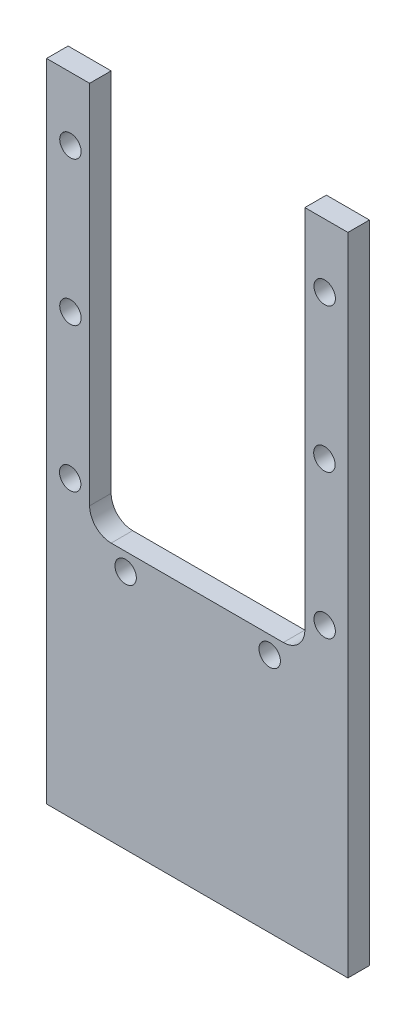
ISO-10303-21;
HEADER;
FILE_DESCRIPTION(('STEP AP214'),'2;1');
FILE_NAME('part.step','',(''),(''),'','','');
FILE_SCHEMA(('AUTOMOTIVE_DESIGN { 1 0 10303 214 1 1 1 1 }'));
ENDSEC;
DATA;
#1=APPLICATION_CONTEXT('core data for automotive mechanical design processes');
#2=APPLICATION_PROTOCOL_DEFINITION('international standard','automotive_design',2000,#1);
#3=PRODUCT_CONTEXT('',#1,'mechanical');
#4=PRODUCT('Part','Part','',(#3));
#5=PRODUCT_RELATED_PRODUCT_CATEGORY('part','',(#4));
#6=PRODUCT_DEFINITION_FORMATION('','',#4);
#7=PRODUCT_DEFINITION_CONTEXT('part definition',#1,'design');
#8=PRODUCT_DEFINITION('design','',#6,#7);
#9=PRODUCT_DEFINITION_SHAPE('','',#8);
#10=(LENGTH_UNIT() NAMED_UNIT(*) SI_UNIT(.MILLI.,.METRE.));
#11=(NAMED_UNIT(*) PLANE_ANGLE_UNIT() SI_UNIT($,.RADIAN.));
#12=(NAMED_UNIT(*) SI_UNIT($,.STERADIAN.) SOLID_ANGLE_UNIT());
#13=UNCERTAINTY_MEASURE_WITH_UNIT(LENGTH_MEASURE(1.E-05),#10,'distance_accuracy_value','');
#14=(GEOMETRIC_REPRESENTATION_CONTEXT(3) GLOBAL_UNCERTAINTY_ASSIGNED_CONTEXT((#13)) GLOBAL_UNIT_ASSIGNED_CONTEXT((#10,
#11,#12)) REPRESENTATION_CONTEXT('',''));
#15=CARTESIAN_POINT('',(0.,0.,0.));
#16=DIRECTION('',(0.,0.,1.));
#17=DIRECTION('',(1.,0.,0.));
#18=AXIS2_PLACEMENT_3D('',#15,#16,#17);
#19=CARTESIAN_POINT('',(0.,0.,0.));
#20=DIRECTION('',(0.,0.,-1.));
#21=DIRECTION('',(-1.,0.,0.));
#22=AXIS2_PLACEMENT_3D('',#19,#20,#21);
#23=PLANE('',#22);
#24=CARTESIAN_POINT('',(32.820840104079,68.709866644,0.));
#25=DIRECTION('',(0.,0.,1.));
#26=DIRECTION('',(1.,0.,0.));
#27=AXIS2_PLACEMENT_3D('',#24,#25,#26);
#28=CIRCLE('',#27,1.26365);
#29=CARTESIAN_POINT('',(34.084490104079,68.709866644,0.));
#30=VERTEX_POINT('',#29);
#31=EDGE_CURVE('E260',#30,#30,#28,.T.);
#32=ORIENTED_EDGE('',*,*,#31,.T.);
#33=EDGE_LOOP('',(#32));
#34=FACE_BOUND('',#33,.T.);
#35=CARTESIAN_POINT('',(32.7849044982078,51.685945396,0.));
#36=DIRECTION('',(0.,0.,1.));
#37=DIRECTION('',(1.,0.,0.));
#38=AXIS2_PLACEMENT_3D('',#35,#36,#37);
#39=CIRCLE('',#38,1.26365);
#40=CARTESIAN_POINT('',(34.0485544982078,51.685945396,0.));
#41=VERTEX_POINT('',#40);
#42=EDGE_CURVE('E254',#41,#41,#39,.T.);
#43=ORIENTED_EDGE('',*,*,#42,.T.);
#44=EDGE_LOOP('',(#43));
#45=FACE_BOUND('',#44,.T.);
#46=CARTESIAN_POINT('',(32.8160035052399,34.693675088,0.));
#47=DIRECTION('',(0.,0.,1.));
#48=DIRECTION('',(1.,0.,0.));
#49=AXIS2_PLACEMENT_3D('',#46,#47,#48);
#50=CIRCLE('',#49,1.26365);
#51=CARTESIAN_POINT('',(34.0796535052399,34.693675088,0.));
#52=VERTEX_POINT('',#51);
#53=EDGE_CURVE('E248',#52,#52,#50,.T.);
#54=ORIENTED_EDGE('',*,*,#53,.T.);
#55=EDGE_LOOP('',(#54));
#56=FACE_BOUND('',#55,.T.);
#57=CARTESIAN_POINT('',(26.3292378646066,28.403700876,0.));
#58=DIRECTION('',(0.,0.,1.));
#59=DIRECTION('',(1.,0.,0.));
#60=AXIS2_PLACEMENT_3D('',#57,#58,#59);
#61=CIRCLE('',#60,1.26365);
#62=CARTESIAN_POINT('',(27.5928878646066,28.403700876,0.));
#63=VERTEX_POINT('',#62);
#64=EDGE_CURVE('E242',#63,#63,#61,.T.);
#65=ORIENTED_EDGE('',*,*,#64,.T.);
#66=EDGE_LOOP('',(#65));
#67=FACE_BOUND('',#66,.T.);
#68=CARTESIAN_POINT('',(9.32922330405928,28.403700876,0.));
#69=DIRECTION('',(0.,0.,1.));
#70=DIRECTION('',(1.,0.,0.));
#71=AXIS2_PLACEMENT_3D('',#68,#69,#70);
#72=CIRCLE('',#71,1.26365);
#73=CARTESIAN_POINT('',(10.5928733040593,28.403700876,0.));
#74=VERTEX_POINT('',#73);
#75=EDGE_CURVE('E236',#74,#74,#72,.T.);
#76=ORIENTED_EDGE('',*,*,#75,.T.);
#77=EDGE_LOOP('',(#76));
#78=FACE_BOUND('',#77,.T.);
#79=CARTESIAN_POINT('',(2.78490449820778,34.68594536,0.));
#80=DIRECTION('',(0.,0.,1.));
#81=DIRECTION('',(1.,0.,0.));
#82=AXIS2_PLACEMENT_3D('',#79,#80,#81);
#83=CIRCLE('',#82,1.26365);
#84=CARTESIAN_POINT('',(4.04855449820778,34.68594536,0.));
#85=VERTEX_POINT('',#84);
#86=EDGE_CURVE('E230',#85,#85,#83,.T.);
#87=ORIENTED_EDGE('',*,*,#86,.T.);
#88=EDGE_LOOP('',(#87));
#89=FACE_BOUND('',#88,.T.);
#90=CARTESIAN_POINT('',(2.8160035052399,51.696905496,0.));
#91=DIRECTION('',(0.,0.,1.));
#92=DIRECTION('',(1.,0.,0.));
#93=AXIS2_PLACEMENT_3D('',#90,#91,#92);
#94=CIRCLE('',#93,1.26365);
#95=CARTESIAN_POINT('',(4.0796535052399,51.696905496,0.));
#96=VERTEX_POINT('',#95);
#97=EDGE_CURVE('E224',#96,#96,#94,.T.);
#98=ORIENTED_EDGE('',*,*,#97,.T.);
#99=EDGE_LOOP('',(#98));
#100=FACE_BOUND('',#99,.T.);
#101=DIRECTION('',(1.,0.,0.));
#102=VECTOR('',#101,1.);
#103=CARTESIAN_POINT('',(35.56,0.,0.));
#104=LINE('',#103,#102);
#105=CARTESIAN_POINT('',(0.,0.,0.));
#106=VERTEX_POINT('',#105);
#107=CARTESIAN_POINT('',(35.56,0.,0.));
#108=VERTEX_POINT('',#107);
#109=EDGE_CURVE('E139',#106,#108,#104,.T.);
#110=ORIENTED_EDGE('',*,*,#109,.F.);
#111=DIRECTION('',(0.,-1.,0.));
#112=VECTOR('',#111,1.);
#113=CARTESIAN_POINT('',(0.,0.,0.));
#114=LINE('',#113,#112);
#115=CARTESIAN_POINT('',(0.,76.2,0.));
#116=VERTEX_POINT('',#115);
#117=EDGE_CURVE('E135',#116,#106,#114,.T.);
#118=ORIENTED_EDGE('',*,*,#117,.F.);
#119=DIRECTION('',(-1.,0.,0.));
#120=VECTOR('',#119,1.);
#121=CARTESIAN_POINT('',(0.,76.2,0.));
#122=LINE('',#121,#120);
#123=CARTESIAN_POINT('',(5.08,76.2,0.));
#124=VERTEX_POINT('',#123);
#125=EDGE_CURVE('E197',#124,#116,#122,.T.);
#126=ORIENTED_EDGE('',*,*,#125,.F.);
#127=DIRECTION('',(0.,1.,0.));
#128=VECTOR('',#127,1.);
#129=CARTESIAN_POINT('',(5.08,76.2,0.));
#130=LINE('',#129,#128);
#131=CARTESIAN_POINT('',(5.08000000000001,33.02,0.));
#132=VERTEX_POINT('',#131);
#133=EDGE_CURVE('E164',#132,#124,#130,.T.);
#134=ORIENTED_EDGE('',*,*,#133,.F.);
#135=CARTESIAN_POINT('',(7.62000000000001,33.02,0.));
#136=DIRECTION('',(0.,0.,-1.));
#137=DIRECTION('',(-1.,0.,0.));
#138=AXIS2_PLACEMENT_3D('',#135,#136,#137);
#139=CIRCLE('',#138,2.54);
#140=CARTESIAN_POINT('',(7.62000000000001,30.48,0.));
#141=VERTEX_POINT('',#140);
#142=EDGE_CURVE('E48',#132,#141,#139,.F.);
#143=ORIENTED_EDGE('',*,*,#142,.T.);
#144=DIRECTION('',(-1.,0.,0.));
#145=VECTOR('',#144,1.);
#146=CARTESIAN_POINT('',(5.08000000000001,30.48,0.));
#147=LINE('',#146,#145);
#148=CARTESIAN_POINT('',(27.94,30.48,0.));
#149=VERTEX_POINT('',#148);
#150=EDGE_CURVE('E162',#149,#141,#147,.T.);
#151=ORIENTED_EDGE('',*,*,#150,.F.);
#152=CARTESIAN_POINT('',(27.94,33.02,0.));
#153=DIRECTION('',(0.,0.,-1.));
#154=DIRECTION('',(-1.,0.,0.));
#155=AXIS2_PLACEMENT_3D('',#152,#153,#154);
#156=CIRCLE('',#155,2.54);
#157=CARTESIAN_POINT('',(30.48,33.02,0.));
#158=VERTEX_POINT('',#157);
#159=EDGE_CURVE('E154',#149,#158,#156,.F.);
#160=ORIENTED_EDGE('',*,*,#159,.T.);
#161=DIRECTION('',(0.,-1.,0.));
#162=VECTOR('',#161,1.);
#163=CARTESIAN_POINT('',(30.48,30.48,0.));
#164=LINE('',#163,#162);
#165=CARTESIAN_POINT('',(30.48,76.2,0.));
#166=VERTEX_POINT('',#165);
#167=EDGE_CURVE('E169',#166,#158,#164,.T.);
#168=ORIENTED_EDGE('',*,*,#167,.F.);
#169=DIRECTION('',(-1.,0.,0.));
#170=VECTOR('',#169,1.);
#171=CARTESIAN_POINT('',(30.48,76.2,0.));
#172=LINE('',#171,#170);
#173=CARTESIAN_POINT('',(35.56,76.2,0.));
#174=VERTEX_POINT('',#173);
#175=EDGE_CURVE('E192',#174,#166,#172,.T.);
#176=ORIENTED_EDGE('',*,*,#175,.F.);
#177=DIRECTION('',(0.,1.,0.));
#178=VECTOR('',#177,1.);
#179=CARTESIAN_POINT('',(35.56,76.2,0.));
#180=LINE('',#179,#178);
#181=EDGE_CURVE('E189',#108,#174,#180,.T.);
#182=ORIENTED_EDGE('',*,*,#181,.F.);
#183=EDGE_LOOP('',(#110,#118,#126,#134,#143,#151,#160,#168,#176,#182));
#184=FACE_BOUND('',#183,.T.);
#185=CARTESIAN_POINT('',(2.8160035052399,68.709866644,0.));
#186=DIRECTION('',(0.,0.,1.));
#187=DIRECTION('',(1.,0.,0.));
#188=AXIS2_PLACEMENT_3D('',#185,#186,#187);
#189=CIRCLE('',#188,1.26365);
#190=CARTESIAN_POINT('',(4.0796535052399,68.709866644,0.));
#191=VERTEX_POINT('',#190);
#192=EDGE_CURVE('E190',#191,#191,#189,.T.);
#193=ORIENTED_EDGE('',*,*,#192,.T.);
#194=EDGE_LOOP('',(#193));
#195=FACE_BOUND('',#194,.T.);
#196=ADVANCED_FACE('F40',(#34,#45,#56,#67,#78,#89,#100,#184,#195),#23,.T.);
#197=CARTESIAN_POINT('',(35.56,0.,2.54));
#198=DIRECTION('',(0.,1.,0.));
#199=DIRECTION('',(-1.,0.,0.));
#200=AXIS2_PLACEMENT_3D('',#197,#198,#199);
#201=PLANE('',#200);
#202=ORIENTED_EDGE('',*,*,#109,.T.);
#203=DIRECTION('',(0.,0.,-1.));
#204=VECTOR('',#203,1.);
#205=CARTESIAN_POINT('',(35.56,0.,2.54));
#206=LINE('',#205,#204);
#207=CARTESIAN_POINT('',(35.56,0.,2.54));
#208=VERTEX_POINT('',#207);
#209=EDGE_CURVE('E120',#208,#108,#206,.T.);
#210=ORIENTED_EDGE('',*,*,#209,.F.);
#211=DIRECTION('',(1.,0.,0.));
#212=VECTOR('',#211,1.);
#213=CARTESIAN_POINT('',(35.56,0.,2.54));
#214=LINE('',#213,#212);
#215=CARTESIAN_POINT('',(0.,0.,2.54));
#216=VERTEX_POINT('',#215);
#217=EDGE_CURVE('E126',#216,#208,#214,.T.);
#218=ORIENTED_EDGE('',*,*,#217,.F.);
#219=DIRECTION('',(0.,0.,-1.));
#220=VECTOR('',#219,1.);
#221=CARTESIAN_POINT('',(0.,0.,2.54));
#222=LINE('',#221,#220);
#223=EDGE_CURVE('E187',#216,#106,#222,.T.);
#224=ORIENTED_EDGE('',*,*,#223,.T.);
#225=EDGE_LOOP('',(#202,#210,#218,#224));
#226=FACE_BOUND('',#225,.T.);
#227=ADVANCED_FACE('F137',(#226),#201,.F.);
#228=CARTESIAN_POINT('',(35.56,76.2,2.54));
#229=DIRECTION('',(-1.,0.,0.));
#230=DIRECTION('',(0.,-1.,0.));
#231=AXIS2_PLACEMENT_3D('',#228,#229,#230);
#232=PLANE('',#231);
#233=ORIENTED_EDGE('',*,*,#181,.T.);
#234=DIRECTION('',(0.,0.,-1.));
#235=VECTOR('',#234,1.);
#236=CARTESIAN_POINT('',(35.56,76.2,2.54));
#237=LINE('',#236,#235);
#238=CARTESIAN_POINT('',(35.56,76.2,2.54));
#239=VERTEX_POINT('',#238);
#240=EDGE_CURVE('E123',#239,#174,#237,.T.);
#241=ORIENTED_EDGE('',*,*,#240,.F.);
#242=DIRECTION('',(0.,1.,0.));
#243=VECTOR('',#242,1.);
#244=CARTESIAN_POINT('',(35.56,76.2,2.54));
#245=LINE('',#244,#243);
#246=EDGE_CURVE('E116',#208,#239,#245,.T.);
#247=ORIENTED_EDGE('',*,*,#246,.F.);
#248=ORIENTED_EDGE('',*,*,#209,.T.);
#249=EDGE_LOOP('',(#233,#241,#247,#248));
#250=FACE_BOUND('',#249,.T.);
#251=ADVANCED_FACE('F118',(#250),#232,.F.);
#252=CARTESIAN_POINT('',(30.48,76.2,2.54));
#253=DIRECTION('',(0.,-1.,0.));
#254=DIRECTION('',(0.,0.,-1.));
#255=AXIS2_PLACEMENT_3D('',#252,#253,#254);
#256=PLANE('',#255);
#257=ORIENTED_EDGE('',*,*,#175,.T.);
#258=DIRECTION('',(0.,0.,-1.));
#259=VECTOR('',#258,1.);
#260=CARTESIAN_POINT('',(30.48,76.2,2.54));
#261=LINE('',#260,#259);
#262=CARTESIAN_POINT('',(30.48,76.2,2.54));
#263=VERTEX_POINT('',#262);
#264=EDGE_CURVE('E144',#263,#166,#261,.T.);
#265=ORIENTED_EDGE('',*,*,#264,.F.);
#266=DIRECTION('',(-1.,0.,0.));
#267=VECTOR('',#266,1.);
#268=CARTESIAN_POINT('',(30.48,76.2,2.54));
#269=LINE('',#268,#267);
#270=EDGE_CURVE('E125',#239,#263,#269,.T.);
#271=ORIENTED_EDGE('',*,*,#270,.F.);
#272=ORIENTED_EDGE('',*,*,#240,.T.);
#273=EDGE_LOOP('',(#257,#265,#271,#272));
#274=FACE_BOUND('',#273,.T.);
#275=ADVANCED_FACE('F322',(#274),#256,.F.);
#276=CARTESIAN_POINT('',(30.48,30.48,2.54));
#277=DIRECTION('',(1.,0.,0.));
#278=DIRECTION('',(0.,1.,0.));
#279=AXIS2_PLACEMENT_3D('',#276,#277,#278);
#280=PLANE('',#279);
#281=ORIENTED_EDGE('',*,*,#167,.T.);
#282=DIRECTION('',(0.,0.,-1.));
#283=VECTOR('',#282,1.);
#284=CARTESIAN_POINT('',(30.48,33.02,2.54));
#285=LINE('',#284,#283);
#286=CARTESIAN_POINT('',(30.48,33.02,2.54));
#287=VERTEX_POINT('',#286);
#288=EDGE_CURVE('E150',#158,#287,#285,.F.);
#289=ORIENTED_EDGE('',*,*,#288,.T.);
#290=DIRECTION('',(0.,-1.,0.));
#291=VECTOR('',#290,1.);
#292=CARTESIAN_POINT('',(30.48,30.48,2.54));
#293=LINE('',#292,#291);
#294=EDGE_CURVE('E182',#263,#287,#293,.T.);
#295=ORIENTED_EDGE('',*,*,#294,.F.);
#296=ORIENTED_EDGE('',*,*,#264,.T.);
#297=EDGE_LOOP('',(#281,#289,#295,#296));
#298=FACE_BOUND('',#297,.T.);
#299=ADVANCED_FACE('F209',(#298),#280,.F.);
#300=CARTESIAN_POINT('',(5.08000000000001,30.48,2.54));
#301=DIRECTION('',(0.,-1.,0.));
#302=DIRECTION('',(0.,0.,-1.));
#303=AXIS2_PLACEMENT_3D('',#300,#301,#302);
#304=PLANE('',#303);
#305=DIRECTION('',(-1.,0.,0.));
#306=VECTOR('',#305,1.);
#307=CARTESIAN_POINT('',(5.08000000000001,30.48,2.54));
#308=LINE('',#307,#306);
#309=CARTESIAN_POINT('',(27.94,30.48,2.54));
#310=VERTEX_POINT('',#309);
#311=CARTESIAN_POINT('',(7.62000000000001,30.48,2.54));
#312=VERTEX_POINT('',#311);
#313=EDGE_CURVE('E179',#310,#312,#308,.T.);
#314=ORIENTED_EDGE('',*,*,#313,.F.);
#315=DIRECTION('',(0.,0.,-1.));
#316=VECTOR('',#315,1.);
#317=CARTESIAN_POINT('',(27.94,30.48,0.));
#318=LINE('',#317,#316);
#319=EDGE_CURVE('E142',#310,#149,#318,.T.);
#320=ORIENTED_EDGE('',*,*,#319,.T.);
#321=ORIENTED_EDGE('',*,*,#150,.T.);
#322=DIRECTION('',(0.,0.,-1.));
#323=VECTOR('',#322,1.);
#324=CARTESIAN_POINT('',(7.62000000000001,30.48,2.54));
#325=LINE('',#324,#323);
#326=EDGE_CURVE('E140',#141,#312,#325,.F.);
#327=ORIENTED_EDGE('',*,*,#326,.T.);
#328=EDGE_LOOP('',(#314,#320,#321,#327));
#329=FACE_BOUND('',#328,.T.);
#330=ADVANCED_FACE('F167',(#329),#304,.F.);
#331=CARTESIAN_POINT('',(5.08,76.2,2.54));
#332=DIRECTION('',(-1.,0.,0.));
#333=DIRECTION('',(0.,-1.,0.));
#334=AXIS2_PLACEMENT_3D('',#331,#332,#333);
#335=PLANE('',#334);
#336=DIRECTION('',(0.,1.,0.));
#337=VECTOR('',#336,1.);
#338=CARTESIAN_POINT('',(5.08,76.2,2.54));
#339=LINE('',#338,#337);
#340=CARTESIAN_POINT('',(5.08000000000001,33.02,2.54));
#341=VERTEX_POINT('',#340);
#342=CARTESIAN_POINT('',(5.08,76.2,2.54));
#343=VERTEX_POINT('',#342);
#344=EDGE_CURVE('E175',#341,#343,#339,.T.);
#345=ORIENTED_EDGE('',*,*,#344,.F.);
#346=DIRECTION('',(0.,0.,-1.));
#347=VECTOR('',#346,1.);
#348=CARTESIAN_POINT('',(5.08000000000001,33.02,0.));
#349=LINE('',#348,#347);
#350=EDGE_CURVE('E152',#341,#132,#349,.T.);
#351=ORIENTED_EDGE('',*,*,#350,.T.);
#352=ORIENTED_EDGE('',*,*,#133,.T.);
#353=DIRECTION('',(0.,0.,-1.));
#354=VECTOR('',#353,1.);
#355=CARTESIAN_POINT('',(5.08,76.2,2.54));
#356=LINE('',#355,#354);
#357=EDGE_CURVE('E176',#343,#124,#356,.T.);
#358=ORIENTED_EDGE('',*,*,#357,.F.);
#359=EDGE_LOOP('',(#345,#351,#352,#358));
#360=FACE_BOUND('',#359,.T.);
#361=ADVANCED_FACE('F172',(#360),#335,.F.);
#362=CARTESIAN_POINT('',(0.,76.2,2.54));
#363=DIRECTION('',(0.,-1.,0.));
#364=DIRECTION('',(1.,0.,0.));
#365=AXIS2_PLACEMENT_3D('',#362,#363,#364);
#366=PLANE('',#365);
#367=ORIENTED_EDGE('',*,*,#125,.T.);
#368=DIRECTION('',(0.,0.,-1.));
#369=VECTOR('',#368,1.);
#370=CARTESIAN_POINT('',(0.,76.2,2.54));
#371=LINE('',#370,#369);
#372=CARTESIAN_POINT('',(0.,76.2,2.54));
#373=VERTEX_POINT('',#372);
#374=EDGE_CURVE('E201',#373,#116,#371,.T.);
#375=ORIENTED_EDGE('',*,*,#374,.F.);
#376=DIRECTION('',(-1.,0.,0.));
#377=VECTOR('',#376,1.);
#378=CARTESIAN_POINT('',(0.,76.2,2.54));
#379=LINE('',#378,#377);
#380=EDGE_CURVE('E178',#343,#373,#379,.T.);
#381=ORIENTED_EDGE('',*,*,#380,.F.);
#382=ORIENTED_EDGE('',*,*,#357,.T.);
#383=EDGE_LOOP('',(#367,#375,#381,#382));
#384=FACE_BOUND('',#383,.T.);
#385=ADVANCED_FACE('F311',(#384),#366,.F.);
#386=CARTESIAN_POINT('',(0.,0.,2.54));
#387=DIRECTION('',(1.,0.,0.));
#388=DIRECTION('',(0.,0.,-1.));
#389=AXIS2_PLACEMENT_3D('',#386,#387,#388);
#390=PLANE('',#389);
#391=ORIENTED_EDGE('',*,*,#117,.T.);
#392=ORIENTED_EDGE('',*,*,#223,.F.);
#393=DIRECTION('',(0.,-1.,0.));
#394=VECTOR('',#393,1.);
#395=CARTESIAN_POINT('',(0.,0.,2.54));
#396=LINE('',#395,#394);
#397=EDGE_CURVE('E131',#373,#216,#396,.T.);
#398=ORIENTED_EDGE('',*,*,#397,.F.);
#399=ORIENTED_EDGE('',*,*,#374,.T.);
#400=EDGE_LOOP('',(#391,#392,#398,#399));
#401=FACE_BOUND('',#400,.T.);
#402=ADVANCED_FACE('F271',(#401),#390,.F.);
#403=CARTESIAN_POINT('',(0.,0.,2.54));
#404=DIRECTION('',(0.,0.,-1.));
#405=DIRECTION('',(-1.,0.,0.));
#406=AXIS2_PLACEMENT_3D('',#403,#404,#405);
#407=PLANE('',#406);
#408=CARTESIAN_POINT('',(32.820840104079,68.709866644,2.54));
#409=DIRECTION('',(0.,0.,1.));
#410=DIRECTION('',(1.,0.,0.));
#411=AXIS2_PLACEMENT_3D('',#408,#409,#410);
#412=CIRCLE('',#411,1.26365);
#413=CARTESIAN_POINT('',(34.084490104079,68.709866644,2.54));
#414=VERTEX_POINT('',#413);
#415=EDGE_CURVE('E263',#414,#414,#412,.T.);
#416=ORIENTED_EDGE('',*,*,#415,.F.);
#417=EDGE_LOOP('',(#416));
#418=FACE_BOUND('',#417,.T.);
#419=CARTESIAN_POINT('',(32.7849044982078,51.685945396,2.54));
#420=DIRECTION('',(0.,0.,1.));
#421=DIRECTION('',(1.,0.,0.));
#422=AXIS2_PLACEMENT_3D('',#419,#420,#421);
#423=CIRCLE('',#422,1.26365);
#424=CARTESIAN_POINT('',(34.0485544982078,51.685945396,2.54));
#425=VERTEX_POINT('',#424);
#426=EDGE_CURVE('E257',#425,#425,#423,.T.);
#427=ORIENTED_EDGE('',*,*,#426,.F.);
#428=EDGE_LOOP('',(#427));
#429=FACE_BOUND('',#428,.T.);
#430=CARTESIAN_POINT('',(32.8160035052399,34.693675088,2.54));
#431=DIRECTION('',(0.,0.,1.));
#432=DIRECTION('',(1.,0.,0.));
#433=AXIS2_PLACEMENT_3D('',#430,#431,#432);
#434=CIRCLE('',#433,1.26365);
#435=CARTESIAN_POINT('',(34.0796535052399,34.693675088,2.54));
#436=VERTEX_POINT('',#435);
#437=EDGE_CURVE('E251',#436,#436,#434,.T.);
#438=ORIENTED_EDGE('',*,*,#437,.F.);
#439=EDGE_LOOP('',(#438));
#440=FACE_BOUND('',#439,.T.);
#441=CARTESIAN_POINT('',(26.3292378646066,28.403700876,2.54));
#442=DIRECTION('',(0.,0.,1.));
#443=DIRECTION('',(1.,0.,0.));
#444=AXIS2_PLACEMENT_3D('',#441,#442,#443);
#445=CIRCLE('',#444,1.26365);
#446=CARTESIAN_POINT('',(27.5928878646066,28.403700876,2.54));
#447=VERTEX_POINT('',#446);
#448=EDGE_CURVE('E245',#447,#447,#445,.T.);
#449=ORIENTED_EDGE('',*,*,#448,.F.);
#450=EDGE_LOOP('',(#449));
#451=FACE_BOUND('',#450,.T.);
#452=CARTESIAN_POINT('',(9.32922330405928,28.403700876,2.54));
#453=DIRECTION('',(0.,0.,1.));
#454=DIRECTION('',(1.,0.,0.));
#455=AXIS2_PLACEMENT_3D('',#452,#453,#454);
#456=CIRCLE('',#455,1.26365);
#457=CARTESIAN_POINT('',(10.5928733040593,28.403700876,2.54));
#458=VERTEX_POINT('',#457);
#459=EDGE_CURVE('E239',#458,#458,#456,.T.);
#460=ORIENTED_EDGE('',*,*,#459,.F.);
#461=EDGE_LOOP('',(#460));
#462=FACE_BOUND('',#461,.T.);
#463=CARTESIAN_POINT('',(2.78490449820778,34.68594536,2.54));
#464=DIRECTION('',(0.,0.,1.));
#465=DIRECTION('',(1.,0.,0.));
#466=AXIS2_PLACEMENT_3D('',#463,#464,#465);
#467=CIRCLE('',#466,1.26365);
#468=CARTESIAN_POINT('',(4.04855449820778,34.68594536,2.54));
#469=VERTEX_POINT('',#468);
#470=EDGE_CURVE('E233',#469,#469,#467,.T.);
#471=ORIENTED_EDGE('',*,*,#470,.F.);
#472=EDGE_LOOP('',(#471));
#473=FACE_BOUND('',#472,.T.);
#474=CARTESIAN_POINT('',(2.8160035052399,51.696905496,2.54));
#475=DIRECTION('',(0.,0.,1.));
#476=DIRECTION('',(1.,0.,0.));
#477=AXIS2_PLACEMENT_3D('',#474,#475,#476);
#478=CIRCLE('',#477,1.26365);
#479=CARTESIAN_POINT('',(4.0796535052399,51.696905496,2.54));
#480=VERTEX_POINT('',#479);
#481=EDGE_CURVE('E227',#480,#480,#478,.T.);
#482=ORIENTED_EDGE('',*,*,#481,.F.);
#483=EDGE_LOOP('',(#482));
#484=FACE_BOUND('',#483,.T.);
#485=CARTESIAN_POINT('',(2.8160035052399,68.709866644,2.54));
#486=DIRECTION('',(0.,0.,1.));
#487=DIRECTION('',(1.,0.,0.));
#488=AXIS2_PLACEMENT_3D('',#485,#486,#487);
#489=CIRCLE('',#488,1.26365);
#490=CARTESIAN_POINT('',(4.0796535052399,68.709866644,2.54));
#491=VERTEX_POINT('',#490);
#492=EDGE_CURVE('E221',#491,#491,#489,.T.);
#493=ORIENTED_EDGE('',*,*,#492,.F.);
#494=EDGE_LOOP('',(#493));
#495=FACE_BOUND('',#494,.T.);
#496=ORIENTED_EDGE('',*,*,#217,.T.);
#497=ORIENTED_EDGE('',*,*,#246,.T.);
#498=ORIENTED_EDGE('',*,*,#270,.T.);
#499=ORIENTED_EDGE('',*,*,#294,.T.);
#500=CARTESIAN_POINT('',(27.94,33.02,2.54));
#501=DIRECTION('',(0.,0.,-1.));
#502=DIRECTION('',(-1.,0.,0.));
#503=AXIS2_PLACEMENT_3D('',#500,#501,#502);
#504=CIRCLE('',#503,2.54);
#505=EDGE_CURVE('E156',#287,#310,#504,.T.);
#506=ORIENTED_EDGE('',*,*,#505,.T.);
#507=ORIENTED_EDGE('',*,*,#313,.T.);
#508=CARTESIAN_POINT('',(7.62000000000001,33.02,2.54));
#509=DIRECTION('',(0.,0.,-1.));
#510=DIRECTION('',(-1.,0.,0.));
#511=AXIS2_PLACEMENT_3D('',#508,#509,#510);
#512=CIRCLE('',#511,2.54);
#513=EDGE_CURVE('E11',#312,#341,#512,.T.);
#514=ORIENTED_EDGE('',*,*,#513,.T.);
#515=ORIENTED_EDGE('',*,*,#344,.T.);
#516=ORIENTED_EDGE('',*,*,#380,.T.);
#517=ORIENTED_EDGE('',*,*,#397,.T.);
#518=EDGE_LOOP('',(#496,#497,#498,#499,#506,#507,#514,#515,#516,#517));
#519=FACE_BOUND('',#518,.T.);
#520=ADVANCED_FACE('F129',(#418,#429,#440,#451,#462,#473,#484,#495,#519),#407,.F.);
#521=CARTESIAN_POINT('',(27.94,33.02,2.54));
#522=DIRECTION('',(0.,0.,1.));
#523=DIRECTION('',(1.,0.,0.));
#524=AXIS2_PLACEMENT_3D('',#521,#522,#523);
#525=CYLINDRICAL_SURFACE('',#524,2.54);
#526=ORIENTED_EDGE('',*,*,#505,.F.);
#527=ORIENTED_EDGE('',*,*,#288,.F.);
#528=ORIENTED_EDGE('',*,*,#159,.F.);
#529=ORIENTED_EDGE('',*,*,#319,.F.);
#530=EDGE_LOOP('',(#526,#527,#528,#529));
#531=FACE_BOUND('',#530,.T.);
#532=ADVANCED_FACE('F216',(#531),#525,.F.);
#533=CARTESIAN_POINT('',(7.62000000000001,33.02,2.54));
#534=DIRECTION('',(0.,0.,1.));
#535=DIRECTION('',(1.,0.,0.));
#536=AXIS2_PLACEMENT_3D('',#533,#534,#535);
#537=CYLINDRICAL_SURFACE('',#536,2.54);
#538=ORIENTED_EDGE('',*,*,#513,.F.);
#539=ORIENTED_EDGE('',*,*,#326,.F.);
#540=ORIENTED_EDGE('',*,*,#142,.F.);
#541=ORIENTED_EDGE('',*,*,#350,.F.);
#542=EDGE_LOOP('',(#538,#539,#540,#541));
#543=FACE_BOUND('',#542,.T.);
#544=ADVANCED_FACE('F42',(#543),#537,.F.);
#545=CARTESIAN_POINT('',(2.8160035052399,68.709866644,2.54));
#546=DIRECTION('',(0.,0.,1.));
#547=DIRECTION('',(1.,0.,0.));
#548=AXIS2_PLACEMENT_3D('',#545,#546,#547);
#549=CYLINDRICAL_SURFACE('',#548,1.26365);
#550=ORIENTED_EDGE('',*,*,#192,.F.);
#551=EDGE_LOOP('',(#550));
#552=FACE_BOUND('',#551,.T.);
#553=ORIENTED_EDGE('',*,*,#492,.T.);
#554=EDGE_LOOP('',(#553));
#555=FACE_BOUND('',#554,.T.);
#556=ADVANCED_FACE('F287',(#552,#555),#549,.F.);
#557=CARTESIAN_POINT('',(2.8160035052399,51.696905496,2.54));
#558=DIRECTION('',(0.,0.,1.));
#559=DIRECTION('',(1.,0.,0.));
#560=AXIS2_PLACEMENT_3D('',#557,#558,#559);
#561=CYLINDRICAL_SURFACE('',#560,1.26365);
#562=ORIENTED_EDGE('',*,*,#97,.F.);
#563=EDGE_LOOP('',(#562));
#564=FACE_BOUND('',#563,.T.);
#565=ORIENTED_EDGE('',*,*,#481,.T.);
#566=EDGE_LOOP('',(#565));
#567=FACE_BOUND('',#566,.T.);
#568=ADVANCED_FACE('F289',(#564,#567),#561,.F.);
#569=CARTESIAN_POINT('',(2.78490449820778,34.68594536,2.54));
#570=DIRECTION('',(0.,0.,1.));
#571=DIRECTION('',(1.,0.,0.));
#572=AXIS2_PLACEMENT_3D('',#569,#570,#571);
#573=CYLINDRICAL_SURFACE('',#572,1.26365);
#574=ORIENTED_EDGE('',*,*,#86,.F.);
#575=EDGE_LOOP('',(#574));
#576=FACE_BOUND('',#575,.T.);
#577=ORIENTED_EDGE('',*,*,#470,.T.);
#578=EDGE_LOOP('',(#577));
#579=FACE_BOUND('',#578,.T.);
#580=ADVANCED_FACE('F296',(#576,#579),#573,.F.);
#581=CARTESIAN_POINT('',(9.32922330405928,28.403700876,2.54));
#582=DIRECTION('',(0.,0.,1.));
#583=DIRECTION('',(1.,0.,0.));
#584=AXIS2_PLACEMENT_3D('',#581,#582,#583);
#585=CYLINDRICAL_SURFACE('',#584,1.26365);
#586=ORIENTED_EDGE('',*,*,#75,.F.);
#587=EDGE_LOOP('',(#586));
#588=FACE_BOUND('',#587,.T.);
#589=ORIENTED_EDGE('',*,*,#459,.T.);
#590=EDGE_LOOP('',(#589));
#591=FACE_BOUND('',#590,.T.);
#592=ADVANCED_FACE('F368',(#588,#591),#585,.F.);
#593=CARTESIAN_POINT('',(26.3292378646066,28.403700876,2.54));
#594=DIRECTION('',(0.,0.,1.));
#595=DIRECTION('',(1.,0.,0.));
#596=AXIS2_PLACEMENT_3D('',#593,#594,#595);
#597=CYLINDRICAL_SURFACE('',#596,1.26365);
#598=ORIENTED_EDGE('',*,*,#64,.F.);
#599=EDGE_LOOP('',(#598));
#600=FACE_BOUND('',#599,.T.);
#601=ORIENTED_EDGE('',*,*,#448,.T.);
#602=EDGE_LOOP('',(#601));
#603=FACE_BOUND('',#602,.T.);
#604=ADVANCED_FACE('F379',(#600,#603),#597,.F.);
#605=CARTESIAN_POINT('',(32.8160035052399,34.693675088,2.54));
#606=DIRECTION('',(0.,0.,1.));
#607=DIRECTION('',(1.,0.,0.));
#608=AXIS2_PLACEMENT_3D('',#605,#606,#607);
#609=CYLINDRICAL_SURFACE('',#608,1.26365);
#610=ORIENTED_EDGE('',*,*,#53,.F.);
#611=EDGE_LOOP('',(#610));
#612=FACE_BOUND('',#611,.T.);
#613=ORIENTED_EDGE('',*,*,#437,.T.);
#614=EDGE_LOOP('',(#613));
#615=FACE_BOUND('',#614,.T.);
#616=ADVANCED_FACE('F390',(#612,#615),#609,.F.);
#617=CARTESIAN_POINT('',(32.7849044982078,51.685945396,2.54));
#618=DIRECTION('',(0.,0.,1.));
#619=DIRECTION('',(1.,0.,0.));
#620=AXIS2_PLACEMENT_3D('',#617,#618,#619);
#621=CYLINDRICAL_SURFACE('',#620,1.26365);
#622=ORIENTED_EDGE('',*,*,#42,.F.);
#623=EDGE_LOOP('',(#622));
#624=FACE_BOUND('',#623,.T.);
#625=ORIENTED_EDGE('',*,*,#426,.T.);
#626=EDGE_LOOP('',(#625));
#627=FACE_BOUND('',#626,.T.);
#628=ADVANCED_FACE('F401',(#624,#627),#621,.F.);
#629=CARTESIAN_POINT('',(32.820840104079,68.709866644,2.54));
#630=DIRECTION('',(0.,0.,1.));
#631=DIRECTION('',(1.,0.,0.));
#632=AXIS2_PLACEMENT_3D('',#629,#630,#631);
#633=CYLINDRICAL_SURFACE('',#632,1.26365);
#634=ORIENTED_EDGE('',*,*,#31,.F.);
#635=EDGE_LOOP('',(#634));
#636=FACE_BOUND('',#635,.T.);
#637=ORIENTED_EDGE('',*,*,#415,.T.);
#638=EDGE_LOOP('',(#637));
#639=FACE_BOUND('',#638,.T.);
#640=ADVANCED_FACE('F267',(#636,#639),#633,.F.);
#641=CLOSED_SHELL('',(#196,#227,#251,#275,#299,#330,#361,#385,#402,#520,#532,#544,#556,#568,
#580,#592,#604,#616,#628,#640));
#642=MANIFOLD_SOLID_BREP('B2',#641);
#643=ADVANCED_BREP_SHAPE_REPRESENTATION('',(#18,#642),#14);
#644=SHAPE_DEFINITION_REPRESENTATION(#9,#643);
ENDSEC;
END-ISO-10303-21;
